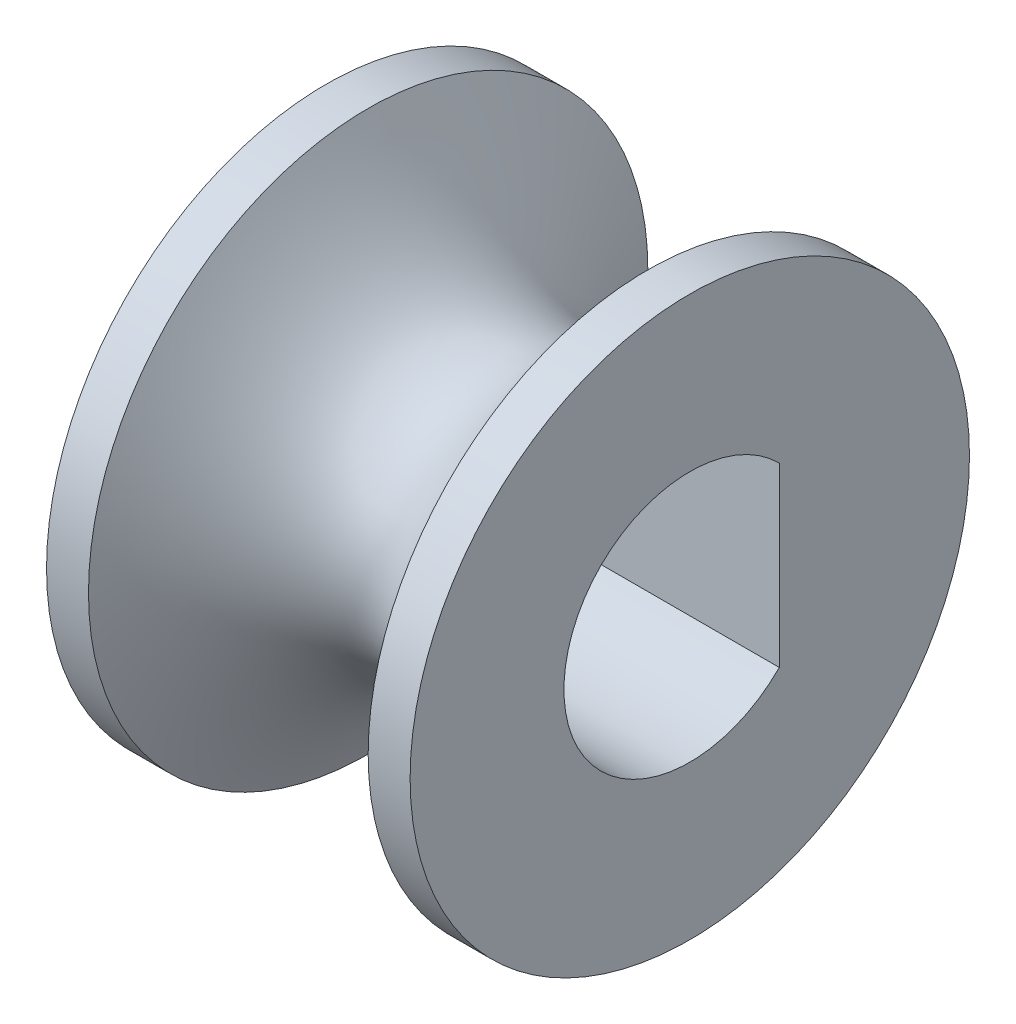
ISO-10303-21;
HEADER;
FILE_DESCRIPTION(('STEP AP214'),'2;1');
FILE_NAME('part.step','',(''),(''),'','','');
FILE_SCHEMA(('AUTOMOTIVE_DESIGN { 1 0 10303 214 1 1 1 1 }'));
ENDSEC;
DATA;
#1=APPLICATION_CONTEXT('core data for automotive mechanical design processes');
#2=APPLICATION_PROTOCOL_DEFINITION('international standard','automotive_design',2000,#1);
#3=PRODUCT_CONTEXT('',#1,'mechanical');
#4=PRODUCT('Part','Part','',(#3));
#5=PRODUCT_RELATED_PRODUCT_CATEGORY('part','',(#4));
#6=PRODUCT_DEFINITION_FORMATION('','',#4);
#7=PRODUCT_DEFINITION_CONTEXT('part definition',#1,'design');
#8=PRODUCT_DEFINITION('design','',#6,#7);
#9=PRODUCT_DEFINITION_SHAPE('','',#8);
#10=(LENGTH_UNIT() NAMED_UNIT(*) SI_UNIT(.MILLI.,.METRE.));
#11=(NAMED_UNIT(*) PLANE_ANGLE_UNIT() SI_UNIT($,.RADIAN.));
#12=(NAMED_UNIT(*) SI_UNIT($,.STERADIAN.) SOLID_ANGLE_UNIT());
#13=UNCERTAINTY_MEASURE_WITH_UNIT(LENGTH_MEASURE(1.E-05),#10,'distance_accuracy_value','');
#14=(GEOMETRIC_REPRESENTATION_CONTEXT(3) GLOBAL_UNCERTAINTY_ASSIGNED_CONTEXT((#13)) GLOBAL_UNIT_ASSIGNED_CONTEXT((#10,
#11,#12)) REPRESENTATION_CONTEXT('',''));
#15=CARTESIAN_POINT('',(0.,0.,0.));
#16=DIRECTION('',(0.,0.,1.));
#17=DIRECTION('',(1.,0.,0.));
#18=AXIS2_PLACEMENT_3D('',#15,#16,#17);
#19=CARTESIAN_POINT('',(3.25,0.,-5.));
#20=DIRECTION('',(1.,0.,0.));
#21=DIRECTION('',(0.,0.,-1.));
#22=AXIS2_PLACEMENT_3D('',#19,#20,#21);
#23=PLANE('',#22);
#24=CARTESIAN_POINT('',(3.25,0.,0.));
#25=DIRECTION('',(1.,0.,0.));
#26=DIRECTION('',(0.,0.,-1.));
#27=AXIS2_PLACEMENT_3D('',#24,#25,#26);
#28=CIRCLE('',#27,2.25);
#29=CARTESIAN_POINT('',(3.25,1.58192920195564,-1.6));
#30=VERTEX_POINT('',#29);
#31=CARTESIAN_POINT('',(3.25,-1.58192920195564,-1.6));
#32=VERTEX_POINT('',#31);
#33=EDGE_CURVE('E60',#30,#32,#28,.T.);
#34=ORIENTED_EDGE('',*,*,#33,.F.);
#35=DIRECTION('',(0.,1.,0.));
#36=VECTOR('',#35,1.);
#37=CARTESIAN_POINT('',(3.25,0.,-1.6));
#38=LINE('',#37,#36);
#39=EDGE_CURVE('E62',#32,#30,#38,.T.);
#40=ORIENTED_EDGE('',*,*,#39,.F.);
#41=EDGE_LOOP('',(#34,#40));
#42=FACE_BOUND('',#41,.T.);
#43=CARTESIAN_POINT('',(3.25,0.,0.));
#44=DIRECTION('',(1.,0.,0.));
#45=DIRECTION('',(0.,0.,-1.));
#46=AXIS2_PLACEMENT_3D('',#43,#44,#45);
#47=CIRCLE('',#46,5.);
#48=CARTESIAN_POINT('',(3.25,0.,-5.));
#49=VERTEX_POINT('',#48);
#50=EDGE_CURVE('E77',#49,#49,#47,.T.);
#51=ORIENTED_EDGE('',*,*,#50,.T.);
#52=EDGE_LOOP('',(#51));
#53=FACE_BOUND('',#52,.T.);
#54=ADVANCED_FACE('F32',(#42,#53),#23,.T.);
#55=CARTESIAN_POINT('',(-3.25,0.,0.));
#56=DIRECTION('',(-1.,0.,0.));
#57=DIRECTION('',(0.,0.,1.));
#58=AXIS2_PLACEMENT_3D('',#55,#56,#57);
#59=PLANE('',#58);
#60=CARTESIAN_POINT('',(-3.25,0.,0.));
#61=DIRECTION('',(-1.,0.,0.));
#62=DIRECTION('',(0.,0.,-1.));
#63=AXIS2_PLACEMENT_3D('',#60,#61,#62);
#64=CIRCLE('',#63,2.25);
#65=CARTESIAN_POINT('',(-3.25,-1.58192920195564,-1.6));
#66=VERTEX_POINT('',#65);
#67=CARTESIAN_POINT('',(-3.25,1.58192920195564,-1.6));
#68=VERTEX_POINT('',#67);
#69=EDGE_CURVE('E53',#66,#68,#64,.T.);
#70=ORIENTED_EDGE('',*,*,#69,.F.);
#71=DIRECTION('',(0.,-1.,0.));
#72=VECTOR('',#71,1.);
#73=CARTESIAN_POINT('',(-3.25,-1.58192920195564,-1.6));
#74=LINE('',#73,#72);
#75=EDGE_CURVE('E66',#68,#66,#74,.T.);
#76=ORIENTED_EDGE('',*,*,#75,.F.);
#77=EDGE_LOOP('',(#70,#76));
#78=FACE_BOUND('',#77,.T.);
#79=CARTESIAN_POINT('',(-3.25,0.,0.));
#80=DIRECTION('',(1.,0.,0.));
#81=DIRECTION('',(0.,0.,-1.));
#82=AXIS2_PLACEMENT_3D('',#79,#80,#81);
#83=CIRCLE('',#82,5.);
#84=CARTESIAN_POINT('',(-3.25,0.,-5.));
#85=VERTEX_POINT('',#84);
#86=EDGE_CURVE('E11',#85,#85,#83,.T.);
#87=ORIENTED_EDGE('',*,*,#86,.F.);
#88=EDGE_LOOP('',(#87));
#89=FACE_BOUND('',#88,.T.);
#90=ADVANCED_FACE('F70',(#78,#89),#59,.T.);
#91=CARTESIAN_POINT('',(0.,0.,0.));
#92=DIRECTION('',(1.,0.,0.));
#93=DIRECTION('',(0.,0.,-1.));
#94=AXIS2_PLACEMENT_3D('',#91,#92,#93);
#95=CYLINDRICAL_SURFACE('',#94,5.);
#96=ORIENTED_EDGE('',*,*,#86,.T.);
#97=EDGE_LOOP('',(#96));
#98=FACE_BOUND('',#97,.T.);
#99=CARTESIAN_POINT('',(-2.5,0.,0.));
#100=DIRECTION('',(1.,0.,0.));
#101=DIRECTION('',(0.,0.,-1.));
#102=AXIS2_PLACEMENT_3D('',#99,#100,#101);
#103=CIRCLE('',#102,5.);
#104=CARTESIAN_POINT('',(-2.5,0.,-5.));
#105=VERTEX_POINT('',#104);
#106=EDGE_CURVE('E39',#105,#105,#103,.T.);
#107=ORIENTED_EDGE('',*,*,#106,.F.);
#108=EDGE_LOOP('',(#107));
#109=FACE_BOUND('',#108,.T.);
#110=ADVANCED_FACE('F92',(#98,#109),#95,.T.);
#111=CARTESIAN_POINT('',(2.5,0.,-5.));
#112=CARTESIAN_POINT('',(-9.44108762109058E-07,0.,5.33928912367643E-13));
#113=CARTESIAN_POINT('',(-2.5,0.,-5.));
#114=B_SPLINE_CURVE_WITH_KNOTS('',2,(#111,#112,#113),.UNSPECIFIED.,.F.,.F.,(3,3),(0.,1.),.UNSPECIFIED.);
#115=CARTESIAN_POINT('',(0.,0.,0.));
#116=DIRECTION('',(1.,0.,0.));
#117=AXIS1_PLACEMENT('',#115,#116);
#118=SURFACE_OF_REVOLUTION('',#114,#117);
#119=ORIENTED_EDGE('',*,*,#106,.T.);
#120=EDGE_LOOP('',(#119));
#121=FACE_BOUND('',#120,.T.);
#122=CARTESIAN_POINT('',(2.5,0.,0.));
#123=DIRECTION('',(1.,0.,0.));
#124=DIRECTION('',(0.,0.,-1.));
#125=AXIS2_PLACEMENT_3D('',#122,#123,#124);
#126=CIRCLE('',#125,5.);
#127=CARTESIAN_POINT('',(2.5,0.,-5.));
#128=VERTEX_POINT('',#127);
#129=EDGE_CURVE('E108',#128,#128,#126,.T.);
#130=ORIENTED_EDGE('',*,*,#129,.F.);
#131=EDGE_LOOP('',(#130));
#132=FACE_BOUND('',#131,.T.);
#133=ADVANCED_FACE('F87',(#121,#132),#118,.F.);
#134=CARTESIAN_POINT('',(0.,0.,0.));
#135=DIRECTION('',(1.,0.,0.));
#136=DIRECTION('',(0.,0.,-1.));
#137=AXIS2_PLACEMENT_3D('',#134,#135,#136);
#138=CYLINDRICAL_SURFACE('',#137,5.);
#139=ORIENTED_EDGE('',*,*,#129,.T.);
#140=EDGE_LOOP('',(#139));
#141=FACE_BOUND('',#140,.T.);
#142=ORIENTED_EDGE('',*,*,#50,.F.);
#143=EDGE_LOOP('',(#142));
#144=FACE_BOUND('',#143,.T.);
#145=ADVANCED_FACE('F91',(#141,#144),#138,.T.);
#146=CARTESIAN_POINT('',(6.75,0.,0.));
#147=DIRECTION('',(-1.,0.,0.));
#148=DIRECTION('',(0.,0.,1.));
#149=AXIS2_PLACEMENT_3D('',#146,#147,#148);
#150=CYLINDRICAL_SURFACE('',#149,2.25);
#151=ORIENTED_EDGE('',*,*,#33,.T.);
#152=DIRECTION('',(-1.,0.,0.));
#153=VECTOR('',#152,1.);
#154=CARTESIAN_POINT('',(6.75,-1.58192920195564,-1.6));
#155=LINE('',#154,#153);
#156=EDGE_CURVE('E46',#32,#66,#155,.T.);
#157=ORIENTED_EDGE('',*,*,#156,.T.);
#158=ORIENTED_EDGE('',*,*,#69,.T.);
#159=DIRECTION('',(-1.,0.,0.));
#160=VECTOR('',#159,1.);
#161=CARTESIAN_POINT('',(6.75,1.58192920195564,-1.6));
#162=LINE('',#161,#160);
#163=EDGE_CURVE('E63',#30,#68,#162,.T.);
#164=ORIENTED_EDGE('',*,*,#163,.F.);
#165=EDGE_LOOP('',(#151,#157,#158,#164));
#166=FACE_BOUND('',#165,.T.);
#167=ADVANCED_FACE('F58',(#166),#150,.F.);
#168=CARTESIAN_POINT('',(6.75,-1.58192920195564,-1.6));
#169=DIRECTION('',(0.,0.,-1.));
#170=DIRECTION('',(-1.,0.,0.));
#171=AXIS2_PLACEMENT_3D('',#168,#169,#170);
#172=PLANE('',#171);
#173=ORIENTED_EDGE('',*,*,#39,.T.);
#174=ORIENTED_EDGE('',*,*,#163,.T.);
#175=ORIENTED_EDGE('',*,*,#75,.T.);
#176=ORIENTED_EDGE('',*,*,#156,.F.);
#177=EDGE_LOOP('',(#173,#174,#175,#176));
#178=FACE_BOUND('',#177,.T.);
#179=ADVANCED_FACE('F67',(#178),#172,.F.);
#180=CLOSED_SHELL('',(#54,#90,#110,#133,#145,#167,#179));
#181=MANIFOLD_SOLID_BREP('B2',#180);
#182=ADVANCED_BREP_SHAPE_REPRESENTATION('',(#18,#181),#14);
#183=SHAPE_DEFINITION_REPRESENTATION(#9,#182);
ENDSEC;
END-ISO-10303-21;
